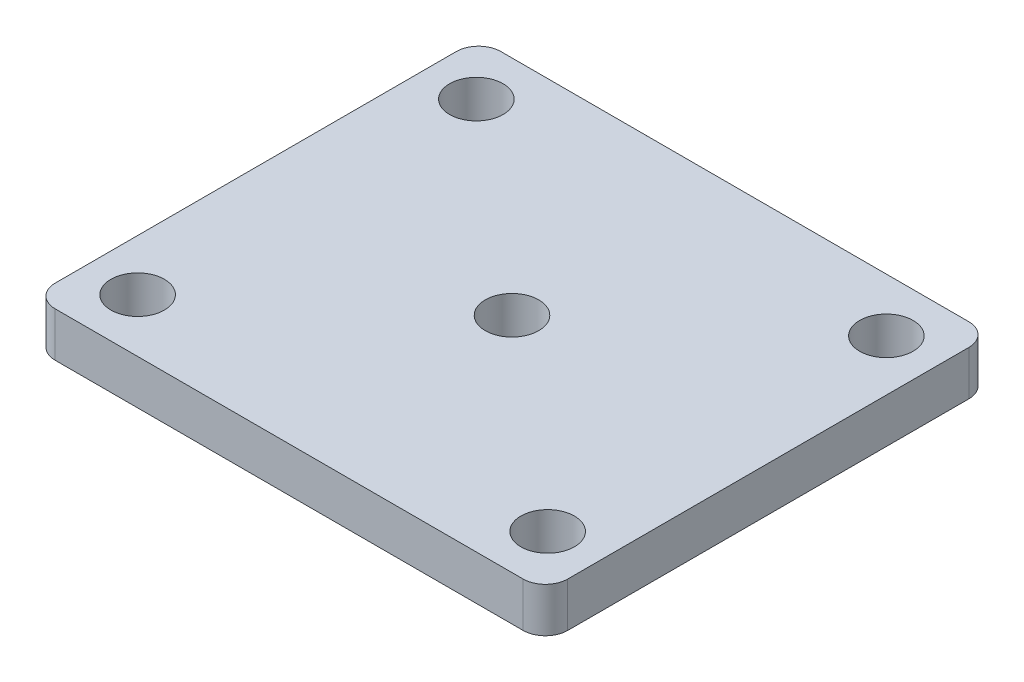
ISO-10303-21;
HEADER;
FILE_DESCRIPTION(('STEP AP214'),'2;1');
FILE_NAME('part.step','',(''),(''),'','','');
FILE_SCHEMA(('AUTOMOTIVE_DESIGN { 1 0 10303 214 1 1 1 1 }'));
ENDSEC;
DATA;
#1=APPLICATION_CONTEXT('core data for automotive mechanical design processes');
#2=APPLICATION_PROTOCOL_DEFINITION('international standard','automotive_design',2000,#1);
#3=PRODUCT_CONTEXT('',#1,'mechanical');
#4=PRODUCT('Part','Part','',(#3));
#5=PRODUCT_RELATED_PRODUCT_CATEGORY('part','',(#4));
#6=PRODUCT_DEFINITION_FORMATION('','',#4);
#7=PRODUCT_DEFINITION_CONTEXT('part definition',#1,'design');
#8=PRODUCT_DEFINITION('design','',#6,#7);
#9=PRODUCT_DEFINITION_SHAPE('','',#8);
#10=(LENGTH_UNIT() NAMED_UNIT(*) SI_UNIT(.MILLI.,.METRE.));
#11=(NAMED_UNIT(*) PLANE_ANGLE_UNIT() SI_UNIT($,.RADIAN.));
#12=(NAMED_UNIT(*) SI_UNIT($,.STERADIAN.) SOLID_ANGLE_UNIT());
#13=UNCERTAINTY_MEASURE_WITH_UNIT(LENGTH_MEASURE(1.E-05),#10,'distance_accuracy_value','');
#14=(GEOMETRIC_REPRESENTATION_CONTEXT(3) GLOBAL_UNCERTAINTY_ASSIGNED_CONTEXT((#13)) GLOBAL_UNIT_ASSIGNED_CONTEXT((#10,
#11,#12)) REPRESENTATION_CONTEXT('',''));
#15=CARTESIAN_POINT('',(0.,0.,0.));
#16=DIRECTION('',(0.,0.,1.));
#17=DIRECTION('',(1.,0.,0.));
#18=AXIS2_PLACEMENT_3D('',#15,#16,#17);
#19=CARTESIAN_POINT('',(-57.5,10.,0.));
#20=DIRECTION('',(-1.,0.,0.));
#21=DIRECTION('',(0.,0.,1.));
#22=AXIS2_PLACEMENT_3D('',#19,#20,#21);
#23=PLANE('',#22);
#24=DIRECTION('',(0.,0.,-1.));
#25=VECTOR('',#24,1.);
#26=CARTESIAN_POINT('',(-57.5,10.,0.));
#27=LINE('',#26,#25);
#28=CARTESIAN_POINT('',(-57.5,10.,45.));
#29=VERTEX_POINT('',#28);
#30=CARTESIAN_POINT('',(-57.5,10.,-45.));
#31=VERTEX_POINT('',#30);
#32=EDGE_CURVE('E165',#29,#31,#27,.T.);
#33=ORIENTED_EDGE('',*,*,#32,.T.);
#34=DIRECTION('',(0.,-1.,0.));
#35=VECTOR('',#34,1.);
#36=CARTESIAN_POINT('',(-57.5,0.,-45.));
#37=LINE('',#36,#35);
#38=CARTESIAN_POINT('',(-57.5,0.,-45.));
#39=VERTEX_POINT('',#38);
#40=EDGE_CURVE('E118',#31,#39,#37,.T.);
#41=ORIENTED_EDGE('',*,*,#40,.T.);
#42=DIRECTION('',(0.,0.,-1.));
#43=VECTOR('',#42,1.);
#44=CARTESIAN_POINT('',(-57.5,0.,0.));
#45=LINE('',#44,#43);
#46=CARTESIAN_POINT('',(-57.5,0.,45.));
#47=VERTEX_POINT('',#46);
#48=EDGE_CURVE('E110',#47,#39,#45,.T.);
#49=ORIENTED_EDGE('',*,*,#48,.F.);
#50=DIRECTION('',(0.,-1.,0.));
#51=VECTOR('',#50,1.);
#52=CARTESIAN_POINT('',(-57.5,10.,45.));
#53=LINE('',#52,#51);
#54=EDGE_CURVE('E123',#47,#29,#53,.F.);
#55=ORIENTED_EDGE('',*,*,#54,.T.);
#56=EDGE_LOOP('',(#33,#41,#49,#55));
#57=FACE_BOUND('',#56,.T.);
#58=ADVANCED_FACE('F40',(#57),#23,.T.);
#59=CARTESIAN_POINT('',(0.,10.,50.));
#60=DIRECTION('',(0.,0.,1.));
#61=DIRECTION('',(1.,0.,0.));
#62=AXIS2_PLACEMENT_3D('',#59,#60,#61);
#63=PLANE('',#62);
#64=DIRECTION('',(-1.,0.,0.));
#65=VECTOR('',#64,1.);
#66=CARTESIAN_POINT('',(0.,0.,50.));
#67=LINE('',#66,#65);
#68=CARTESIAN_POINT('',(52.5,0.,50.));
#69=VERTEX_POINT('',#68);
#70=CARTESIAN_POINT('',(-52.5,0.,50.));
#71=VERTEX_POINT('',#70);
#72=EDGE_CURVE('E112',#69,#71,#67,.T.);
#73=ORIENTED_EDGE('',*,*,#72,.F.);
#74=DIRECTION('',(0.,-1.,0.));
#75=VECTOR('',#74,1.);
#76=CARTESIAN_POINT('',(52.5,10.,50.));
#77=LINE('',#76,#75);
#78=CARTESIAN_POINT('',(52.5,10.,50.));
#79=VERTEX_POINT('',#78);
#80=EDGE_CURVE('E11',#69,#79,#77,.F.);
#81=ORIENTED_EDGE('',*,*,#80,.T.);
#82=DIRECTION('',(-1.,0.,0.));
#83=VECTOR('',#82,1.);
#84=CARTESIAN_POINT('',(0.,10.,50.));
#85=LINE('',#84,#83);
#86=CARTESIAN_POINT('',(-52.5,10.,50.));
#87=VERTEX_POINT('',#86);
#88=EDGE_CURVE('E163',#79,#87,#85,.T.);
#89=ORIENTED_EDGE('',*,*,#88,.T.);
#90=DIRECTION('',(0.,-1.,0.));
#91=VECTOR('',#90,1.);
#92=CARTESIAN_POINT('',(-52.5,10.,50.));
#93=LINE('',#92,#91);
#94=EDGE_CURVE('E48',#87,#71,#93,.T.);
#95=ORIENTED_EDGE('',*,*,#94,.T.);
#96=EDGE_LOOP('',(#73,#81,#89,#95));
#97=FACE_BOUND('',#96,.T.);
#98=ADVANCED_FACE('F161',(#97),#63,.T.);
#99=CARTESIAN_POINT('',(57.5,10.,0.));
#100=DIRECTION('',(-1.,0.,0.));
#101=DIRECTION('',(0.,0.,1.));
#102=AXIS2_PLACEMENT_3D('',#99,#100,#101);
#103=PLANE('',#102);
#104=DIRECTION('',(0.,0.,-1.));
#105=VECTOR('',#104,1.);
#106=CARTESIAN_POINT('',(57.5,0.,0.));
#107=LINE('',#106,#105);
#108=CARTESIAN_POINT('',(57.5,0.,45.));
#109=VERTEX_POINT('',#108);
#110=CARTESIAN_POINT('',(57.5,0.,-45.));
#111=VERTEX_POINT('',#110);
#112=EDGE_CURVE('E186',#109,#111,#107,.T.);
#113=ORIENTED_EDGE('',*,*,#112,.T.);
#114=DIRECTION('',(0.,-1.,0.));
#115=VECTOR('',#114,1.);
#116=CARTESIAN_POINT('',(57.5,10.,-45.));
#117=LINE('',#116,#115);
#118=CARTESIAN_POINT('',(57.5,10.,-45.));
#119=VERTEX_POINT('',#118);
#120=EDGE_CURVE('E55',#111,#119,#117,.F.);
#121=ORIENTED_EDGE('',*,*,#120,.T.);
#122=DIRECTION('',(0.,0.,-1.));
#123=VECTOR('',#122,1.);
#124=CARTESIAN_POINT('',(57.5,10.,0.));
#125=LINE('',#124,#123);
#126=CARTESIAN_POINT('',(57.5,10.,45.));
#127=VERTEX_POINT('',#126);
#128=EDGE_CURVE('E164',#127,#119,#125,.T.);
#129=ORIENTED_EDGE('',*,*,#128,.F.);
#130=DIRECTION('',(0.,-1.,0.));
#131=VECTOR('',#130,1.);
#132=CARTESIAN_POINT('',(57.5,0.,45.));
#133=LINE('',#132,#131);
#134=EDGE_CURVE('E156',#127,#109,#133,.T.);
#135=ORIENTED_EDGE('',*,*,#134,.T.);
#136=EDGE_LOOP('',(#113,#121,#129,#135));
#137=FACE_BOUND('',#136,.T.);
#138=ADVANCED_FACE('F237',(#137),#103,.F.);
#139=CARTESIAN_POINT('',(46.,10.,38.));
#140=DIRECTION('',(0.,-1.,0.));
#141=DIRECTION('',(0.,0.,-1.));
#142=AXIS2_PLACEMENT_3D('',#139,#140,#141);
#143=CYLINDRICAL_SURFACE('',#142,6.);
#144=CARTESIAN_POINT('',(46.,10.,38.));
#145=DIRECTION('',(0.,1.,0.));
#146=DIRECTION('',(0.,0.,1.));
#147=AXIS2_PLACEMENT_3D('',#144,#145,#146);
#148=CIRCLE('',#147,6.);
#149=CARTESIAN_POINT('',(46.,10.,44.));
#150=VERTEX_POINT('',#149);
#151=EDGE_CURVE('E134',#150,#150,#148,.T.);
#152=ORIENTED_EDGE('',*,*,#151,.T.);
#153=EDGE_LOOP('',(#152));
#154=FACE_BOUND('',#153,.T.);
#155=CARTESIAN_POINT('',(46.,0.,38.));
#156=DIRECTION('',(0.,1.,0.));
#157=DIRECTION('',(0.,0.,1.));
#158=AXIS2_PLACEMENT_3D('',#155,#156,#157);
#159=CIRCLE('',#158,6.);
#160=CARTESIAN_POINT('',(46.,0.,44.));
#161=VERTEX_POINT('',#160);
#162=EDGE_CURVE('E190',#161,#161,#159,.T.);
#163=ORIENTED_EDGE('',*,*,#162,.F.);
#164=EDGE_LOOP('',(#163));
#165=FACE_BOUND('',#164,.T.);
#166=ADVANCED_FACE('F268',(#154,#165),#143,.F.);
#167=CARTESIAN_POINT('',(0.,10.,-50.));
#168=DIRECTION('',(0.,0.,1.));
#169=DIRECTION('',(1.,0.,0.));
#170=AXIS2_PLACEMENT_3D('',#167,#168,#169);
#171=PLANE('',#170);
#172=DIRECTION('',(-1.,0.,0.));
#173=VECTOR('',#172,1.);
#174=CARTESIAN_POINT('',(0.,0.,-50.));
#175=LINE('',#174,#173);
#176=CARTESIAN_POINT('',(52.5,0.,-50.));
#177=VERTEX_POINT('',#176);
#178=CARTESIAN_POINT('',(-52.5,0.,-50.));
#179=VERTEX_POINT('',#178);
#180=EDGE_CURVE('E188',#177,#179,#175,.T.);
#181=ORIENTED_EDGE('',*,*,#180,.T.);
#182=DIRECTION('',(0.,-1.,0.));
#183=VECTOR('',#182,1.);
#184=CARTESIAN_POINT('',(-52.5,10.,-50.));
#185=LINE('',#184,#183);
#186=CARTESIAN_POINT('',(-52.5,10.,-50.));
#187=VERTEX_POINT('',#186);
#188=EDGE_CURVE('E148',#179,#187,#185,.F.);
#189=ORIENTED_EDGE('',*,*,#188,.T.);
#190=DIRECTION('',(-1.,0.,0.));
#191=VECTOR('',#190,1.);
#192=CARTESIAN_POINT('',(0.,10.,-50.));
#193=LINE('',#192,#191);
#194=CARTESIAN_POINT('',(52.5,10.,-50.));
#195=VERTEX_POINT('',#194);
#196=EDGE_CURVE('E167',#195,#187,#193,.T.);
#197=ORIENTED_EDGE('',*,*,#196,.F.);
#198=DIRECTION('',(0.,-1.,0.));
#199=VECTOR('',#198,1.);
#200=CARTESIAN_POINT('',(52.5,10.,-50.));
#201=LINE('',#200,#199);
#202=EDGE_CURVE('E145',#195,#177,#201,.T.);
#203=ORIENTED_EDGE('',*,*,#202,.T.);
#204=EDGE_LOOP('',(#181,#189,#197,#203));
#205=FACE_BOUND('',#204,.T.);
#206=ADVANCED_FACE('F243',(#205),#171,.F.);
#207=CARTESIAN_POINT('',(-46.,10.,-38.));
#208=DIRECTION('',(0.,-1.,0.));
#209=DIRECTION('',(0.,0.,-1.));
#210=AXIS2_PLACEMENT_3D('',#207,#208,#209);
#211=CYLINDRICAL_SURFACE('',#210,6.);
#212=CARTESIAN_POINT('',(-46.,10.,-38.));
#213=DIRECTION('',(0.,1.,0.));
#214=DIRECTION('',(0.,0.,1.));
#215=AXIS2_PLACEMENT_3D('',#212,#213,#214);
#216=CIRCLE('',#215,6.);
#217=CARTESIAN_POINT('',(-46.,10.,-32.));
#218=VERTEX_POINT('',#217);
#219=EDGE_CURVE('E169',#218,#218,#216,.T.);
#220=ORIENTED_EDGE('',*,*,#219,.T.);
#221=EDGE_LOOP('',(#220));
#222=FACE_BOUND('',#221,.T.);
#223=CARTESIAN_POINT('',(-46.,0.,-38.));
#224=DIRECTION('',(0.,1.,0.));
#225=DIRECTION('',(0.,0.,1.));
#226=AXIS2_PLACEMENT_3D('',#223,#224,#225);
#227=CIRCLE('',#226,6.);
#228=CARTESIAN_POINT('',(-46.,0.,-32.));
#229=VERTEX_POINT('',#228);
#230=EDGE_CURVE('E126',#229,#229,#227,.T.);
#231=ORIENTED_EDGE('',*,*,#230,.F.);
#232=EDGE_LOOP('',(#231));
#233=FACE_BOUND('',#232,.T.);
#234=ADVANCED_FACE('F207',(#222,#233),#211,.F.);
#235=CARTESIAN_POINT('',(46.,10.,-38.));
#236=DIRECTION('',(0.,-1.,0.));
#237=DIRECTION('',(0.,0.,-1.));
#238=AXIS2_PLACEMENT_3D('',#235,#236,#237);
#239=CYLINDRICAL_SURFACE('',#238,6.);
#240=CARTESIAN_POINT('',(46.,10.,-38.));
#241=DIRECTION('',(0.,1.,0.));
#242=DIRECTION('',(0.,0.,1.));
#243=AXIS2_PLACEMENT_3D('',#240,#241,#242);
#244=CIRCLE('',#243,6.);
#245=CARTESIAN_POINT('',(46.,10.,-32.));
#246=VERTEX_POINT('',#245);
#247=EDGE_CURVE('E198',#246,#246,#244,.F.);
#248=ORIENTED_EDGE('',*,*,#247,.F.);
#249=EDGE_LOOP('',(#248));
#250=FACE_BOUND('',#249,.T.);
#251=CARTESIAN_POINT('',(46.,0.,-38.));
#252=DIRECTION('',(0.,1.,0.));
#253=DIRECTION('',(0.,0.,1.));
#254=AXIS2_PLACEMENT_3D('',#251,#252,#253);
#255=CIRCLE('',#254,6.);
#256=CARTESIAN_POINT('',(46.,0.,-32.));
#257=VERTEX_POINT('',#256);
#258=EDGE_CURVE('E180',#257,#257,#255,.F.);
#259=ORIENTED_EDGE('',*,*,#258,.T.);
#260=EDGE_LOOP('',(#259));
#261=FACE_BOUND('',#260,.T.);
#262=ADVANCED_FACE('F228',(#250,#261),#239,.F.);
#263=CARTESIAN_POINT('',(0.,10.,0.));
#264=DIRECTION('',(0.,-1.,0.));
#265=DIRECTION('',(0.,0.,-1.));
#266=AXIS2_PLACEMENT_3D('',#263,#264,#265);
#267=CYLINDRICAL_SURFACE('',#266,6.);
#268=CARTESIAN_POINT('',(0.,10.,0.));
#269=DIRECTION('',(0.,1.,0.));
#270=DIRECTION('',(0.,0.,1.));
#271=AXIS2_PLACEMENT_3D('',#268,#269,#270);
#272=CIRCLE('',#271,6.);
#273=CARTESIAN_POINT('',(0.,10.,6.));
#274=VERTEX_POINT('',#273);
#275=EDGE_CURVE('E194',#274,#274,#272,.T.);
#276=ORIENTED_EDGE('',*,*,#275,.T.);
#277=EDGE_LOOP('',(#276));
#278=FACE_BOUND('',#277,.T.);
#279=CARTESIAN_POINT('',(0.,0.,0.));
#280=DIRECTION('',(0.,1.,0.));
#281=DIRECTION('',(0.,0.,1.));
#282=AXIS2_PLACEMENT_3D('',#279,#280,#281);
#283=CIRCLE('',#282,6.);
#284=CARTESIAN_POINT('',(0.,0.,6.));
#285=VERTEX_POINT('',#284);
#286=EDGE_CURVE('E177',#285,#285,#283,.T.);
#287=ORIENTED_EDGE('',*,*,#286,.F.);
#288=EDGE_LOOP('',(#287));
#289=FACE_BOUND('',#288,.T.);
#290=ADVANCED_FACE('F223',(#278,#289),#267,.F.);
#291=CARTESIAN_POINT('',(-46.,10.,38.));
#292=DIRECTION('',(0.,-1.,0.));
#293=DIRECTION('',(0.,0.,-1.));
#294=AXIS2_PLACEMENT_3D('',#291,#292,#293);
#295=CYLINDRICAL_SURFACE('',#294,6.);
#296=CARTESIAN_POINT('',(-46.,10.,38.));
#297=DIRECTION('',(0.,1.,0.));
#298=DIRECTION('',(0.,0.,1.));
#299=AXIS2_PLACEMENT_3D('',#296,#297,#298);
#300=CIRCLE('',#299,6.);
#301=CARTESIAN_POINT('',(-46.,10.,44.));
#302=VERTEX_POINT('',#301);
#303=EDGE_CURVE('E130',#302,#302,#300,.F.);
#304=ORIENTED_EDGE('',*,*,#303,.F.);
#305=EDGE_LOOP('',(#304));
#306=FACE_BOUND('',#305,.T.);
#307=CARTESIAN_POINT('',(-46.,0.,38.));
#308=DIRECTION('',(0.,1.,0.));
#309=DIRECTION('',(0.,0.,1.));
#310=AXIS2_PLACEMENT_3D('',#307,#308,#309);
#311=CIRCLE('',#310,6.);
#312=CARTESIAN_POINT('',(-46.,0.,44.));
#313=VERTEX_POINT('',#312);
#314=EDGE_CURVE('E137',#313,#313,#311,.F.);
#315=ORIENTED_EDGE('',*,*,#314,.T.);
#316=EDGE_LOOP('',(#315));
#317=FACE_BOUND('',#316,.T.);
#318=ADVANCED_FACE('F212',(#306,#317),#295,.F.);
#319=CARTESIAN_POINT('',(0.,10.,0.));
#320=DIRECTION('',(0.,1.,0.));
#321=DIRECTION('',(0.,0.,1.));
#322=AXIS2_PLACEMENT_3D('',#319,#320,#321);
#323=PLANE('',#322);
#324=ORIENTED_EDGE('',*,*,#275,.F.);
#325=EDGE_LOOP('',(#324));
#326=FACE_BOUND('',#325,.T.);
#327=ORIENTED_EDGE('',*,*,#247,.T.);
#328=EDGE_LOOP('',(#327));
#329=FACE_BOUND('',#328,.T.);
#330=ORIENTED_EDGE('',*,*,#219,.F.);
#331=EDGE_LOOP('',(#330));
#332=FACE_BOUND('',#331,.T.);
#333=ORIENTED_EDGE('',*,*,#196,.T.);
#334=CARTESIAN_POINT('',(-52.5,10.,-45.));
#335=DIRECTION('',(0.,1.,0.));
#336=DIRECTION('',(0.,0.,1.));
#337=AXIS2_PLACEMENT_3D('',#334,#335,#336);
#338=CIRCLE('',#337,5.);
#339=EDGE_CURVE('E154',#187,#31,#338,.T.);
#340=ORIENTED_EDGE('',*,*,#339,.T.);
#341=ORIENTED_EDGE('',*,*,#32,.F.);
#342=CARTESIAN_POINT('',(-52.5,10.,45.));
#343=DIRECTION('',(0.,1.,0.));
#344=DIRECTION('',(0.,0.,1.));
#345=AXIS2_PLACEMENT_3D('',#342,#343,#344);
#346=CIRCLE('',#345,5.);
#347=EDGE_CURVE('E129',#29,#87,#346,.T.);
#348=ORIENTED_EDGE('',*,*,#347,.T.);
#349=ORIENTED_EDGE('',*,*,#88,.F.);
#350=CARTESIAN_POINT('',(52.5,10.,45.));
#351=DIRECTION('',(0.,1.,0.));
#352=DIRECTION('',(0.,0.,1.));
#353=AXIS2_PLACEMENT_3D('',#350,#351,#352);
#354=CIRCLE('',#353,5.);
#355=EDGE_CURVE('E62',#79,#127,#354,.T.);
#356=ORIENTED_EDGE('',*,*,#355,.T.);
#357=ORIENTED_EDGE('',*,*,#128,.T.);
#358=CARTESIAN_POINT('',(52.5,10.,-45.));
#359=DIRECTION('',(0.,1.,0.));
#360=DIRECTION('',(0.,0.,1.));
#361=AXIS2_PLACEMENT_3D('',#358,#359,#360);
#362=CIRCLE('',#361,5.);
#363=EDGE_CURVE('E152',#119,#195,#362,.T.);
#364=ORIENTED_EDGE('',*,*,#363,.T.);
#365=EDGE_LOOP('',(#333,#340,#341,#348,#349,#356,#357,#364));
#366=FACE_BOUND('',#365,.T.);
#367=ORIENTED_EDGE('',*,*,#151,.F.);
#368=EDGE_LOOP('',(#367));
#369=FACE_BOUND('',#368,.T.);
#370=ORIENTED_EDGE('',*,*,#303,.T.);
#371=EDGE_LOOP('',(#370));
#372=FACE_BOUND('',#371,.T.);
#373=ADVANCED_FACE('F210',(#326,#329,#332,#366,#369,#372),#323,.T.);
#374=CARTESIAN_POINT('',(0.,0.,0.));
#375=DIRECTION('',(0.,1.,0.));
#376=DIRECTION('',(0.,0.,1.));
#377=AXIS2_PLACEMENT_3D('',#374,#375,#376);
#378=PLANE('',#377);
#379=ORIENTED_EDGE('',*,*,#286,.T.);
#380=EDGE_LOOP('',(#379));
#381=FACE_BOUND('',#380,.T.);
#382=ORIENTED_EDGE('',*,*,#258,.F.);
#383=EDGE_LOOP('',(#382));
#384=FACE_BOUND('',#383,.T.);
#385=ORIENTED_EDGE('',*,*,#230,.T.);
#386=EDGE_LOOP('',(#385));
#387=FACE_BOUND('',#386,.T.);
#388=ORIENTED_EDGE('',*,*,#48,.T.);
#389=CARTESIAN_POINT('',(-52.5,0.,-45.));
#390=DIRECTION('',(0.,1.,0.));
#391=DIRECTION('',(0.,0.,1.));
#392=AXIS2_PLACEMENT_3D('',#389,#390,#391);
#393=CIRCLE('',#392,5.);
#394=EDGE_CURVE('E143',#39,#179,#393,.F.);
#395=ORIENTED_EDGE('',*,*,#394,.T.);
#396=ORIENTED_EDGE('',*,*,#180,.F.);
#397=CARTESIAN_POINT('',(52.5,0.,-45.));
#398=DIRECTION('',(0.,1.,0.));
#399=DIRECTION('',(0.,0.,1.));
#400=AXIS2_PLACEMENT_3D('',#397,#398,#399);
#401=CIRCLE('',#400,5.);
#402=EDGE_CURVE('E141',#177,#111,#401,.F.);
#403=ORIENTED_EDGE('',*,*,#402,.T.);
#404=ORIENTED_EDGE('',*,*,#112,.F.);
#405=CARTESIAN_POINT('',(52.5,0.,45.));
#406=DIRECTION('',(0.,1.,0.));
#407=DIRECTION('',(0.,0.,1.));
#408=AXIS2_PLACEMENT_3D('',#405,#406,#407);
#409=CIRCLE('',#408,5.);
#410=EDGE_CURVE('E117',#109,#69,#409,.F.);
#411=ORIENTED_EDGE('',*,*,#410,.T.);
#412=ORIENTED_EDGE('',*,*,#72,.T.);
#413=CARTESIAN_POINT('',(-52.5,0.,45.));
#414=DIRECTION('',(0.,1.,0.));
#415=DIRECTION('',(0.,0.,1.));
#416=AXIS2_PLACEMENT_3D('',#413,#414,#415);
#417=CIRCLE('',#416,5.);
#418=EDGE_CURVE('E106',#71,#47,#417,.F.);
#419=ORIENTED_EDGE('',*,*,#418,.T.);
#420=EDGE_LOOP('',(#388,#395,#396,#403,#404,#411,#412,#419));
#421=FACE_BOUND('',#420,.T.);
#422=ORIENTED_EDGE('',*,*,#162,.T.);
#423=EDGE_LOOP('',(#422));
#424=FACE_BOUND('',#423,.T.);
#425=ORIENTED_EDGE('',*,*,#314,.F.);
#426=EDGE_LOOP('',(#425));
#427=FACE_BOUND('',#426,.T.);
#428=ADVANCED_FACE('F108',(#381,#384,#387,#421,#424,#427),#378,.F.);
#429=CARTESIAN_POINT('',(-52.5,10.,-45.));
#430=DIRECTION('',(0.,1.,0.));
#431=DIRECTION('',(0.,0.,1.));
#432=AXIS2_PLACEMENT_3D('',#429,#430,#431);
#433=CYLINDRICAL_SURFACE('',#432,5.);
#434=ORIENTED_EDGE('',*,*,#339,.F.);
#435=ORIENTED_EDGE('',*,*,#188,.F.);
#436=ORIENTED_EDGE('',*,*,#394,.F.);
#437=ORIENTED_EDGE('',*,*,#40,.F.);
#438=EDGE_LOOP('',(#434,#435,#436,#437));
#439=FACE_BOUND('',#438,.T.);
#440=ADVANCED_FACE('F247',(#439),#433,.T.);
#441=CARTESIAN_POINT('',(52.5,10.,-45.));
#442=DIRECTION('',(0.,-1.,0.));
#443=DIRECTION('',(0.,0.,-1.));
#444=AXIS2_PLACEMENT_3D('',#441,#442,#443);
#445=CYLINDRICAL_SURFACE('',#444,5.);
#446=ORIENTED_EDGE('',*,*,#363,.F.);
#447=ORIENTED_EDGE('',*,*,#120,.F.);
#448=ORIENTED_EDGE('',*,*,#402,.F.);
#449=ORIENTED_EDGE('',*,*,#202,.F.);
#450=EDGE_LOOP('',(#446,#447,#448,#449));
#451=FACE_BOUND('',#450,.T.);
#452=ADVANCED_FACE('F250',(#451),#445,.T.);
#453=CARTESIAN_POINT('',(52.5,10.,45.));
#454=DIRECTION('',(0.,1.,0.));
#455=DIRECTION('',(0.,0.,1.));
#456=AXIS2_PLACEMENT_3D('',#453,#454,#455);
#457=CYLINDRICAL_SURFACE('',#456,5.);
#458=ORIENTED_EDGE('',*,*,#355,.F.);
#459=ORIENTED_EDGE('',*,*,#80,.F.);
#460=ORIENTED_EDGE('',*,*,#410,.F.);
#461=ORIENTED_EDGE('',*,*,#134,.F.);
#462=EDGE_LOOP('',(#458,#459,#460,#461));
#463=FACE_BOUND('',#462,.T.);
#464=ADVANCED_FACE('F253',(#463),#457,.T.);
#465=CARTESIAN_POINT('',(-52.5,10.,45.));
#466=DIRECTION('',(0.,-1.,0.));
#467=DIRECTION('',(0.,0.,-1.));
#468=AXIS2_PLACEMENT_3D('',#465,#466,#467);
#469=CYLINDRICAL_SURFACE('',#468,5.);
#470=ORIENTED_EDGE('',*,*,#347,.F.);
#471=ORIENTED_EDGE('',*,*,#54,.F.);
#472=ORIENTED_EDGE('',*,*,#418,.F.);
#473=ORIENTED_EDGE('',*,*,#94,.F.);
#474=EDGE_LOOP('',(#470,#471,#472,#473));
#475=FACE_BOUND('',#474,.T.);
#476=ADVANCED_FACE('F42',(#475),#469,.T.);
#477=CLOSED_SHELL('',(#58,#98,#138,#166,#206,#234,#262,#290,#318,#373,#428,#440,#452,#464,#476));
#478=MANIFOLD_SOLID_BREP('B2',#477);
#479=ADVANCED_BREP_SHAPE_REPRESENTATION('',(#18,#478),#14);
#480=SHAPE_DEFINITION_REPRESENTATION(#9,#479);
ENDSEC;
END-ISO-10303-21;
